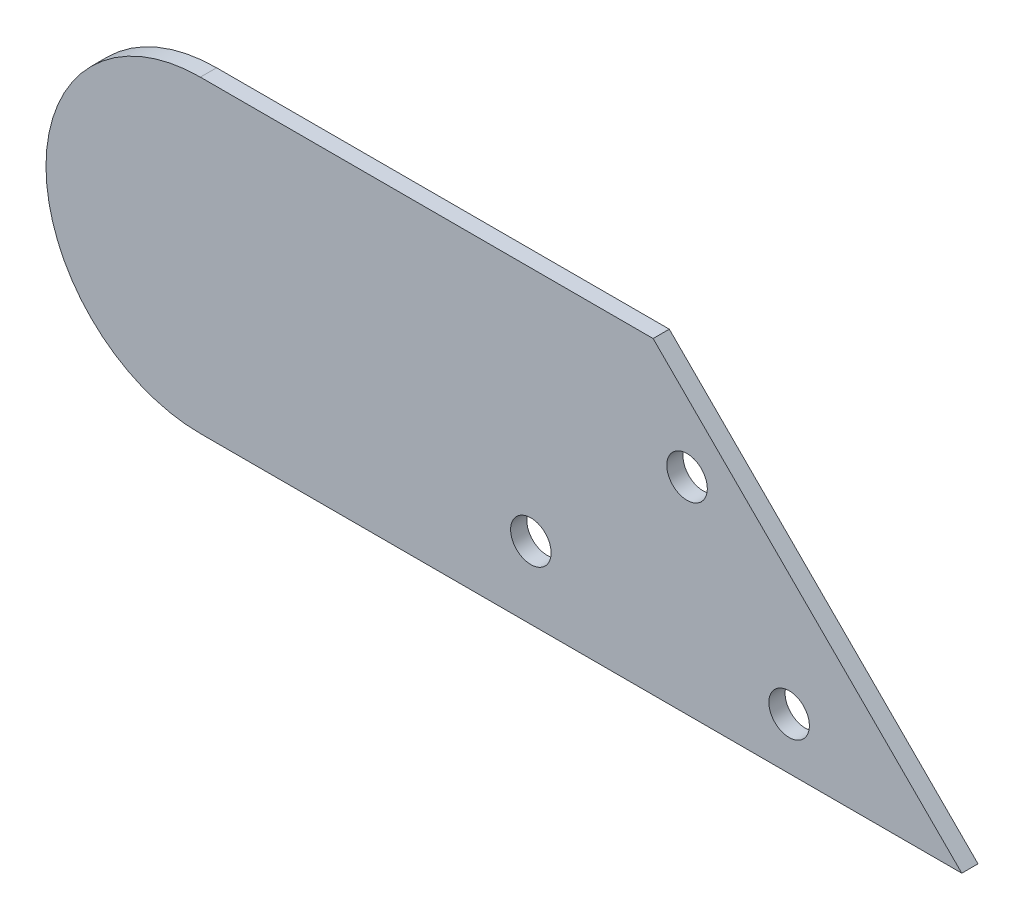
ISO-10303-21;
HEADER;
FILE_DESCRIPTION(('STEP AP214'),'2;1');
FILE_NAME('part.step','',(''),(''),'','','');
FILE_SCHEMA(('AUTOMOTIVE_DESIGN { 1 0 10303 214 1 1 1 1 }'));
ENDSEC;
DATA;
#1=APPLICATION_CONTEXT('core data for automotive mechanical design processes');
#2=APPLICATION_PROTOCOL_DEFINITION('international standard','automotive_design',2000,#1);
#3=PRODUCT_CONTEXT('',#1,'mechanical');
#4=PRODUCT('Part','Part','',(#3));
#5=PRODUCT_RELATED_PRODUCT_CATEGORY('part','',(#4));
#6=PRODUCT_DEFINITION_FORMATION('','',#4);
#7=PRODUCT_DEFINITION_CONTEXT('part definition',#1,'design');
#8=PRODUCT_DEFINITION('design','',#6,#7);
#9=PRODUCT_DEFINITION_SHAPE('','',#8);
#10=(LENGTH_UNIT() NAMED_UNIT(*) SI_UNIT(.MILLI.,.METRE.));
#11=(NAMED_UNIT(*) PLANE_ANGLE_UNIT() SI_UNIT($,.RADIAN.));
#12=(NAMED_UNIT(*) SI_UNIT($,.STERADIAN.) SOLID_ANGLE_UNIT());
#13=UNCERTAINTY_MEASURE_WITH_UNIT(LENGTH_MEASURE(1.E-05),#10,'distance_accuracy_value','');
#14=(GEOMETRIC_REPRESENTATION_CONTEXT(3) GLOBAL_UNCERTAINTY_ASSIGNED_CONTEXT((#13)) GLOBAL_UNIT_ASSIGNED_CONTEXT((#10,
#11,#12)) REPRESENTATION_CONTEXT('',''));
#15=CARTESIAN_POINT('',(0.,0.,0.));
#16=DIRECTION('',(0.,0.,1.));
#17=DIRECTION('',(1.,0.,0.));
#18=AXIS2_PLACEMENT_3D('',#15,#16,#17);
#19=CARTESIAN_POINT('',(0.,0.,2.));
#20=DIRECTION('',(-0.707106781186544,-0.707106781186552,0.));
#21=DIRECTION('',(0.707106781186552,-0.707106781186544,0.));
#22=AXIS2_PLACEMENT_3D('',#19,#20,#21);
#23=PLANE('',#22);
#24=DIRECTION('',(-0.707106781186551,0.707106781186544,0.));
#25=VECTOR('',#24,1.);
#26=CARTESIAN_POINT('',(0.,0.,0.));
#27=LINE('',#26,#25);
#28=CARTESIAN_POINT('',(0.,0.,0.));
#29=VERTEX_POINT('',#28);
#30=CARTESIAN_POINT('',(-38.1000000000004,38.1,0.));
#31=VERTEX_POINT('',#30);
#32=EDGE_CURVE('E103',#29,#31,#27,.T.);
#33=ORIENTED_EDGE('',*,*,#32,.T.);
#34=DIRECTION('',(0.,0.,-1.));
#35=VECTOR('',#34,1.);
#36=CARTESIAN_POINT('',(-38.1000000000004,38.1,2.));
#37=LINE('',#36,#35);
#38=CARTESIAN_POINT('',(-38.1000000000004,38.1,2.));
#39=VERTEX_POINT('',#38);
#40=EDGE_CURVE('E11',#39,#31,#37,.T.);
#41=ORIENTED_EDGE('',*,*,#40,.F.);
#42=DIRECTION('',(-0.707106781186551,0.707106781186544,0.));
#43=VECTOR('',#42,1.);
#44=CARTESIAN_POINT('',(0.,0.,2.));
#45=LINE('',#44,#43);
#46=CARTESIAN_POINT('',(0.,0.,2.));
#47=VERTEX_POINT('',#46);
#48=EDGE_CURVE('E91',#47,#39,#45,.T.);
#49=ORIENTED_EDGE('',*,*,#48,.F.);
#50=DIRECTION('',(0.,0.,-1.));
#51=VECTOR('',#50,1.);
#52=CARTESIAN_POINT('',(0.,0.,2.));
#53=LINE('',#52,#51);
#54=EDGE_CURVE('E99',#47,#29,#53,.T.);
#55=ORIENTED_EDGE('',*,*,#54,.T.);
#56=EDGE_LOOP('',(#33,#41,#49,#55));
#57=FACE_BOUND('',#56,.T.);
#58=ADVANCED_FACE('F40',(#57),#23,.F.);
#59=CARTESIAN_POINT('',(-38.1000000000004,38.1,2.));
#60=DIRECTION('',(0.,-1.,0.));
#61=DIRECTION('',(1.,0.,0.));
#62=AXIS2_PLACEMENT_3D('',#59,#60,#61);
#63=PLANE('',#62);
#64=DIRECTION('',(-1.,0.,0.));
#65=VECTOR('',#64,1.);
#66=CARTESIAN_POINT('',(-38.1000000000004,38.1,0.));
#67=LINE('',#66,#65);
#68=CARTESIAN_POINT('',(-93.98,38.1,0.));
#69=VERTEX_POINT('',#68);
#70=EDGE_CURVE('E95',#31,#69,#67,.T.);
#71=ORIENTED_EDGE('',*,*,#70,.T.);
#72=DIRECTION('',(0.,0.,-1.));
#73=VECTOR('',#72,1.);
#74=CARTESIAN_POINT('',(-93.98,38.1,2.));
#75=LINE('',#74,#73);
#76=CARTESIAN_POINT('',(-93.98,38.1,2.));
#77=VERTEX_POINT('',#76);
#78=EDGE_CURVE('E48',#77,#69,#75,.T.);
#79=ORIENTED_EDGE('',*,*,#78,.F.);
#80=DIRECTION('',(-1.,0.,0.));
#81=VECTOR('',#80,1.);
#82=CARTESIAN_POINT('',(-38.1000000000004,38.1,2.));
#83=LINE('',#82,#81);
#84=EDGE_CURVE('E86',#39,#77,#83,.T.);
#85=ORIENTED_EDGE('',*,*,#84,.F.);
#86=ORIENTED_EDGE('',*,*,#40,.T.);
#87=EDGE_LOOP('',(#71,#79,#85,#86));
#88=FACE_BOUND('',#87,.T.);
#89=ADVANCED_FACE('F94',(#88),#63,.F.);
#90=CARTESIAN_POINT('',(-93.98,19.05,2.));
#91=DIRECTION('',(0.,0.,-1.));
#92=DIRECTION('',(-1.,0.,0.));
#93=AXIS2_PLACEMENT_3D('',#90,#91,#92);
#94=CYLINDRICAL_SURFACE('',#93,19.05);
#95=CARTESIAN_POINT('',(-93.98,19.05,0.));
#96=DIRECTION('',(0.,0.,1.));
#97=DIRECTION('',(1.,0.,0.));
#98=AXIS2_PLACEMENT_3D('',#95,#96,#97);
#99=CIRCLE('',#98,19.05);
#100=CARTESIAN_POINT('',(-93.98,0.,0.));
#101=VERTEX_POINT('',#100);
#102=EDGE_CURVE('E73',#69,#101,#99,.T.);
#103=ORIENTED_EDGE('',*,*,#102,.T.);
#104=DIRECTION('',(0.,0.,-1.));
#105=VECTOR('',#104,1.);
#106=CARTESIAN_POINT('',(-93.98,0.,2.));
#107=LINE('',#106,#105);
#108=CARTESIAN_POINT('',(-93.98,0.,2.));
#109=VERTEX_POINT('',#108);
#110=EDGE_CURVE('E96',#109,#101,#107,.T.);
#111=ORIENTED_EDGE('',*,*,#110,.F.);
#112=CARTESIAN_POINT('',(-93.98,19.05,2.));
#113=DIRECTION('',(0.,0.,1.));
#114=DIRECTION('',(1.,0.,0.));
#115=AXIS2_PLACEMENT_3D('',#112,#113,#114);
#116=CIRCLE('',#115,19.05);
#117=EDGE_CURVE('E89',#77,#109,#116,.T.);
#118=ORIENTED_EDGE('',*,*,#117,.F.);
#119=ORIENTED_EDGE('',*,*,#78,.T.);
#120=EDGE_LOOP('',(#103,#111,#118,#119));
#121=FACE_BOUND('',#120,.T.);
#122=ADVANCED_FACE('F97',(#121),#94,.T.);
#123=CARTESIAN_POINT('',(-93.98,0.,2.));
#124=DIRECTION('',(0.,1.,0.));
#125=DIRECTION('',(0.,0.,1.));
#126=AXIS2_PLACEMENT_3D('',#123,#124,#125);
#127=PLANE('',#126);
#128=DIRECTION('',(1.,0.,0.));
#129=VECTOR('',#128,1.);
#130=CARTESIAN_POINT('',(-93.98,0.,0.));
#131=LINE('',#130,#129);
#132=EDGE_CURVE('E79',#101,#29,#131,.T.);
#133=ORIENTED_EDGE('',*,*,#132,.T.);
#134=ORIENTED_EDGE('',*,*,#54,.F.);
#135=DIRECTION('',(1.,0.,0.));
#136=VECTOR('',#135,1.);
#137=CARTESIAN_POINT('',(-93.98,0.,2.));
#138=LINE('',#137,#136);
#139=EDGE_CURVE('E56',#109,#47,#138,.T.);
#140=ORIENTED_EDGE('',*,*,#139,.F.);
#141=ORIENTED_EDGE('',*,*,#110,.T.);
#142=EDGE_LOOP('',(#133,#134,#140,#141));
#143=FACE_BOUND('',#142,.T.);
#144=ADVANCED_FACE('F111',(#143),#127,.F.);
#145=CARTESIAN_POINT('',(-93.98,19.05,2.));
#146=DIRECTION('',(0.,0.,1.));
#147=DIRECTION('',(1.,0.,0.));
#148=AXIS2_PLACEMENT_3D('',#145,#146,#147);
#149=PLANE('',#148);
#150=CARTESIAN_POINT('',(-53.1876,8.89,2.));
#151=DIRECTION('',(0.,0.,1.));
#152=DIRECTION('',(1.,0.,0.));
#153=AXIS2_PLACEMENT_3D('',#150,#151,#152);
#154=CIRCLE('',#153,2.50000000000001);
#155=CARTESIAN_POINT('',(-50.6876,8.89,2.));
#156=VERTEX_POINT('',#155);
#157=EDGE_CURVE('E106',#156,#156,#154,.T.);
#158=ORIENTED_EDGE('',*,*,#157,.F.);
#159=EDGE_LOOP('',(#158));
#160=FACE_BOUND('',#159,.T.);
#161=CARTESIAN_POINT('',(-21.3117730753564,6.35,2.));
#162=DIRECTION('',(0.,0.,1.));
#163=DIRECTION('',(1.,0.,0.));
#164=AXIS2_PLACEMENT_3D('',#161,#162,#163);
#165=CIRCLE('',#164,2.5);
#166=CARTESIAN_POINT('',(-18.8117730753564,6.35,2.));
#167=VERTEX_POINT('',#166);
#168=EDGE_CURVE('E119',#167,#167,#165,.T.);
#169=ORIENTED_EDGE('',*,*,#168,.F.);
#170=EDGE_LOOP('',(#169));
#171=FACE_BOUND('',#170,.T.);
#172=CARTESIAN_POINT('',(-33.909,25.4,2.));
#173=DIRECTION('',(0.,0.,1.));
#174=DIRECTION('',(1.,0.,0.));
#175=AXIS2_PLACEMENT_3D('',#172,#173,#174);
#176=CIRCLE('',#175,2.5);
#177=CARTESIAN_POINT('',(-31.409,25.4,2.));
#178=VERTEX_POINT('',#177);
#179=EDGE_CURVE('E122',#178,#178,#176,.T.);
#180=ORIENTED_EDGE('',*,*,#179,.F.);
#181=EDGE_LOOP('',(#180));
#182=FACE_BOUND('',#181,.T.);
#183=ORIENTED_EDGE('',*,*,#48,.T.);
#184=ORIENTED_EDGE('',*,*,#84,.T.);
#185=ORIENTED_EDGE('',*,*,#117,.T.);
#186=ORIENTED_EDGE('',*,*,#139,.T.);
#187=EDGE_LOOP('',(#183,#184,#185,#186));
#188=FACE_BOUND('',#187,.T.);
#189=ADVANCED_FACE('F87',(#160,#171,#182,#188),#149,.T.);
#190=CARTESIAN_POINT('',(-93.98,19.05,0.));
#191=DIRECTION('',(0.,0.,1.));
#192=DIRECTION('',(1.,0.,0.));
#193=AXIS2_PLACEMENT_3D('',#190,#191,#192);
#194=PLANE('',#193);
#195=CARTESIAN_POINT('',(-53.1876,8.89,0.));
#196=DIRECTION('',(0.,0.,1.));
#197=DIRECTION('',(1.,0.,0.));
#198=AXIS2_PLACEMENT_3D('',#195,#196,#197);
#199=CIRCLE('',#198,2.50000000000001);
#200=CARTESIAN_POINT('',(-50.6876,8.89,0.));
#201=VERTEX_POINT('',#200);
#202=EDGE_CURVE('E125',#201,#201,#199,.T.);
#203=ORIENTED_EDGE('',*,*,#202,.T.);
#204=EDGE_LOOP('',(#203));
#205=FACE_BOUND('',#204,.T.);
#206=CARTESIAN_POINT('',(-21.3117730753564,6.35,0.));
#207=DIRECTION('',(0.,0.,1.));
#208=DIRECTION('',(1.,0.,0.));
#209=AXIS2_PLACEMENT_3D('',#206,#207,#208);
#210=CIRCLE('',#209,2.5);
#211=CARTESIAN_POINT('',(-18.8117730753564,6.35,0.));
#212=VERTEX_POINT('',#211);
#213=EDGE_CURVE('E129',#212,#212,#210,.T.);
#214=ORIENTED_EDGE('',*,*,#213,.T.);
#215=EDGE_LOOP('',(#214));
#216=FACE_BOUND('',#215,.T.);
#217=CARTESIAN_POINT('',(-33.909,25.4,0.));
#218=DIRECTION('',(0.,0.,1.));
#219=DIRECTION('',(1.,0.,0.));
#220=AXIS2_PLACEMENT_3D('',#217,#218,#219);
#221=CIRCLE('',#220,2.5);
#222=CARTESIAN_POINT('',(-31.409,25.4,0.));
#223=VERTEX_POINT('',#222);
#224=EDGE_CURVE('E126',#223,#223,#221,.T.);
#225=ORIENTED_EDGE('',*,*,#224,.T.);
#226=EDGE_LOOP('',(#225));
#227=FACE_BOUND('',#226,.T.);
#228=ORIENTED_EDGE('',*,*,#32,.F.);
#229=ORIENTED_EDGE('',*,*,#132,.F.);
#230=ORIENTED_EDGE('',*,*,#102,.F.);
#231=ORIENTED_EDGE('',*,*,#70,.F.);
#232=EDGE_LOOP('',(#228,#229,#230,#231));
#233=FACE_BOUND('',#232,.T.);
#234=ADVANCED_FACE('F114',(#205,#216,#227,#233),#194,.F.);
#235=CARTESIAN_POINT('',(-33.909,25.4,0.));
#236=DIRECTION('',(0.,0.,1.));
#237=DIRECTION('',(1.,0.,0.));
#238=AXIS2_PLACEMENT_3D('',#235,#236,#237);
#239=CYLINDRICAL_SURFACE('',#238,2.5);
#240=ORIENTED_EDGE('',*,*,#179,.T.);
#241=EDGE_LOOP('',(#240));
#242=FACE_BOUND('',#241,.T.);
#243=ORIENTED_EDGE('',*,*,#224,.F.);
#244=EDGE_LOOP('',(#243));
#245=FACE_BOUND('',#244,.T.);
#246=ADVANCED_FACE('F145',(#242,#245),#239,.F.);
#247=CARTESIAN_POINT('',(-21.3117730753564,6.35,0.));
#248=DIRECTION('',(0.,0.,1.));
#249=DIRECTION('',(1.,0.,0.));
#250=AXIS2_PLACEMENT_3D('',#247,#248,#249);
#251=CYLINDRICAL_SURFACE('',#250,2.5);
#252=ORIENTED_EDGE('',*,*,#168,.T.);
#253=EDGE_LOOP('',(#252));
#254=FACE_BOUND('',#253,.T.);
#255=ORIENTED_EDGE('',*,*,#213,.F.);
#256=EDGE_LOOP('',(#255));
#257=FACE_BOUND('',#256,.T.);
#258=ADVANCED_FACE('F139',(#254,#257),#251,.F.);
#259=CARTESIAN_POINT('',(-53.1876,8.89,0.));
#260=DIRECTION('',(0.,0.,1.));
#261=DIRECTION('',(1.,0.,0.));
#262=AXIS2_PLACEMENT_3D('',#259,#260,#261);
#263=CYLINDRICAL_SURFACE('',#262,2.50000000000001);
#264=ORIENTED_EDGE('',*,*,#157,.T.);
#265=EDGE_LOOP('',(#264));
#266=FACE_BOUND('',#265,.T.);
#267=ORIENTED_EDGE('',*,*,#202,.F.);
#268=EDGE_LOOP('',(#267));
#269=FACE_BOUND('',#268,.T.);
#270=ADVANCED_FACE('F137',(#266,#269),#263,.F.);
#271=CLOSED_SHELL('',(#58,#89,#122,#144,#189,#234,#246,#258,#270));
#272=MANIFOLD_SOLID_BREP('B2',#271);
#273=ADVANCED_BREP_SHAPE_REPRESENTATION('',(#18,#272),#14);
#274=SHAPE_DEFINITION_REPRESENTATION(#9,#273);
ENDSEC;
END-ISO-10303-21;
